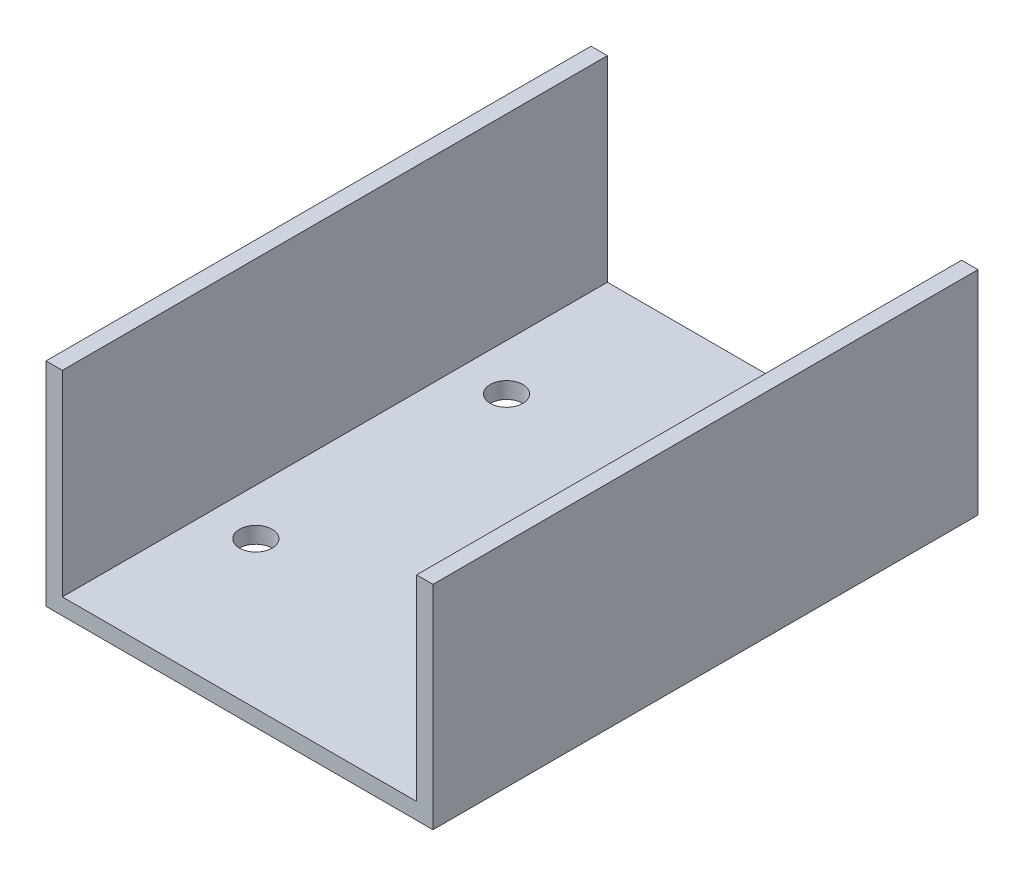
ISO-10303-21;
HEADER;
FILE_DESCRIPTION(('STEP AP214'),'2;1');
FILE_NAME('part.step','',(''),(''),'','','');
FILE_SCHEMA(('AUTOMOTIVE_DESIGN { 1 0 10303 214 1 1 1 1 }'));
ENDSEC;
DATA;
#1=APPLICATION_CONTEXT('core data for automotive mechanical design processes');
#2=APPLICATION_PROTOCOL_DEFINITION('international standard','automotive_design',2000,#1);
#3=PRODUCT_CONTEXT('',#1,'mechanical');
#4=PRODUCT('Part','Part','',(#3));
#5=PRODUCT_RELATED_PRODUCT_CATEGORY('part','',(#4));
#6=PRODUCT_DEFINITION_FORMATION('','',#4);
#7=PRODUCT_DEFINITION_CONTEXT('part definition',#1,'design');
#8=PRODUCT_DEFINITION('design','',#6,#7);
#9=PRODUCT_DEFINITION_SHAPE('','',#8);
#10=(LENGTH_UNIT() NAMED_UNIT(*) SI_UNIT(.MILLI.,.METRE.));
#11=(NAMED_UNIT(*) PLANE_ANGLE_UNIT() SI_UNIT($,.RADIAN.));
#12=(NAMED_UNIT(*) SI_UNIT($,.STERADIAN.) SOLID_ANGLE_UNIT());
#13=UNCERTAINTY_MEASURE_WITH_UNIT(LENGTH_MEASURE(1.E-05),#10,'distance_accuracy_value','');
#14=(GEOMETRIC_REPRESENTATION_CONTEXT(3) GLOBAL_UNCERTAINTY_ASSIGNED_CONTEXT((#13)) GLOBAL_UNIT_ASSIGNED_CONTEXT((#10,
#11,#12)) REPRESENTATION_CONTEXT('',''));
#15=CARTESIAN_POINT('',(0.,0.,0.));
#16=DIRECTION('',(0.,0.,1.));
#17=DIRECTION('',(1.,0.,0.));
#18=AXIS2_PLACEMENT_3D('',#15,#16,#17);
#19=CARTESIAN_POINT('',(17.75,0.,25.));
#20=DIRECTION('',(-1.,0.,0.));
#21=DIRECTION('',(0.,0.,1.));
#22=AXIS2_PLACEMENT_3D('',#19,#20,#21);
#23=PLANE('',#22);
#24=DIRECTION('',(0.,1.,0.));
#25=VECTOR('',#24,1.);
#26=CARTESIAN_POINT('',(17.75,0.,-25.));
#27=LINE('',#26,#25);
#28=CARTESIAN_POINT('',(17.75,0.,-25.));
#29=VERTEX_POINT('',#28);
#30=CARTESIAN_POINT('',(17.75,19.5,-25.));
#31=VERTEX_POINT('',#30);
#32=EDGE_CURVE('E130',#29,#31,#27,.T.);
#33=ORIENTED_EDGE('',*,*,#32,.T.);
#34=DIRECTION('',(0.,0.,-1.));
#35=VECTOR('',#34,1.);
#36=CARTESIAN_POINT('',(17.75,19.5,25.));
#37=LINE('',#36,#35);
#38=CARTESIAN_POINT('',(17.75,19.5,25.));
#39=VERTEX_POINT('',#38);
#40=EDGE_CURVE('E11',#39,#31,#37,.T.);
#41=ORIENTED_EDGE('',*,*,#40,.F.);
#42=DIRECTION('',(0.,1.,0.));
#43=VECTOR('',#42,1.);
#44=CARTESIAN_POINT('',(17.75,0.,25.));
#45=LINE('',#44,#43);
#46=CARTESIAN_POINT('',(17.75,0.,25.));
#47=VERTEX_POINT('',#46);
#48=EDGE_CURVE('E88',#47,#39,#45,.T.);
#49=ORIENTED_EDGE('',*,*,#48,.F.);
#50=DIRECTION('',(0.,0.,-1.));
#51=VECTOR('',#50,1.);
#52=CARTESIAN_POINT('',(17.75,0.,25.));
#53=LINE('',#52,#51);
#54=EDGE_CURVE('E129',#47,#29,#53,.T.);
#55=ORIENTED_EDGE('',*,*,#54,.T.);
#56=EDGE_LOOP('',(#33,#41,#49,#55));
#57=FACE_BOUND('',#56,.T.);
#58=ADVANCED_FACE('F33',(#57),#23,.F.);
#59=CARTESIAN_POINT('',(16.25,19.5,25.));
#60=DIRECTION('',(0.,1.,0.));
#61=DIRECTION('',(0.,0.,1.));
#62=AXIS2_PLACEMENT_3D('',#59,#60,#61);
#63=PLANE('',#62);
#64=DIRECTION('',(1.,0.,0.));
#65=VECTOR('',#64,1.);
#66=CARTESIAN_POINT('',(16.25,19.5,-25.));
#67=LINE('',#66,#65);
#68=CARTESIAN_POINT('',(16.25,19.5,-25.));
#69=VERTEX_POINT('',#68);
#70=EDGE_CURVE('E133',#69,#31,#67,.T.);
#71=ORIENTED_EDGE('',*,*,#70,.F.);
#72=DIRECTION('',(0.,0.,-1.));
#73=VECTOR('',#72,1.);
#74=CARTESIAN_POINT('',(16.25,19.5,25.));
#75=LINE('',#74,#73);
#76=CARTESIAN_POINT('',(16.25,19.5,25.));
#77=VERTEX_POINT('',#76);
#78=EDGE_CURVE('E41',#77,#69,#75,.T.);
#79=ORIENTED_EDGE('',*,*,#78,.F.);
#80=DIRECTION('',(1.,0.,0.));
#81=VECTOR('',#80,1.);
#82=CARTESIAN_POINT('',(16.25,19.5,25.));
#83=LINE('',#82,#81);
#84=EDGE_CURVE('E173',#77,#39,#83,.T.);
#85=ORIENTED_EDGE('',*,*,#84,.T.);
#86=ORIENTED_EDGE('',*,*,#40,.T.);
#87=EDGE_LOOP('',(#71,#79,#85,#86));
#88=FACE_BOUND('',#87,.T.);
#89=ADVANCED_FACE('F164',(#88),#63,.T.);
#90=CARTESIAN_POINT('',(16.25,0.,25.));
#91=DIRECTION('',(-1.,0.,0.));
#92=DIRECTION('',(0.,0.,1.));
#93=AXIS2_PLACEMENT_3D('',#90,#91,#92);
#94=PLANE('',#93);
#95=DIRECTION('',(0.,1.,0.));
#96=VECTOR('',#95,1.);
#97=CARTESIAN_POINT('',(16.25,0.,-25.));
#98=LINE('',#97,#96);
#99=CARTESIAN_POINT('',(16.25,1.5,-25.));
#100=VERTEX_POINT('',#99);
#101=EDGE_CURVE('E137',#100,#69,#98,.T.);
#102=ORIENTED_EDGE('',*,*,#101,.F.);
#103=DIRECTION('',(0.,0.,-1.));
#104=VECTOR('',#103,1.);
#105=CARTESIAN_POINT('',(16.25,1.5,25.));
#106=LINE('',#105,#104);
#107=CARTESIAN_POINT('',(16.25,1.5,25.));
#108=VERTEX_POINT('',#107);
#109=EDGE_CURVE('E154',#108,#100,#106,.T.);
#110=ORIENTED_EDGE('',*,*,#109,.F.);
#111=DIRECTION('',(0.,1.,0.));
#112=VECTOR('',#111,1.);
#113=CARTESIAN_POINT('',(16.25,0.,25.));
#114=LINE('',#113,#112);
#115=EDGE_CURVE('E161',#108,#77,#114,.T.);
#116=ORIENTED_EDGE('',*,*,#115,.T.);
#117=ORIENTED_EDGE('',*,*,#78,.T.);
#118=EDGE_LOOP('',(#102,#110,#116,#117));
#119=FACE_BOUND('',#118,.T.);
#120=ADVANCED_FACE('F159',(#119),#94,.T.);
#121=CARTESIAN_POINT('',(-17.75,1.5,25.));
#122=DIRECTION('',(0.,1.,0.));
#123=DIRECTION('',(0.,0.,1.));
#124=AXIS2_PLACEMENT_3D('',#121,#122,#123);
#125=PLANE('',#124);
#126=CARTESIAN_POINT('',(12.,1.5,11.5));
#127=DIRECTION('',(0.,1.,0.));
#128=DIRECTION('',(0.,0.,1.));
#129=AXIS2_PLACEMENT_3D('',#126,#127,#128);
#130=CIRCLE('',#129,1.5);
#131=CARTESIAN_POINT('',(12.,1.5,13.));
#132=VERTEX_POINT('',#131);
#133=EDGE_CURVE('E134',#132,#132,#130,.T.);
#134=ORIENTED_EDGE('',*,*,#133,.F.);
#135=EDGE_LOOP('',(#134));
#136=FACE_BOUND('',#135,.T.);
#137=CARTESIAN_POINT('',(-12.,1.5,-11.5));
#138=DIRECTION('',(0.,1.,0.));
#139=DIRECTION('',(0.,0.,1.));
#140=AXIS2_PLACEMENT_3D('',#137,#138,#139);
#141=CIRCLE('',#140,1.5);
#142=CARTESIAN_POINT('',(-12.,1.5,-10.));
#143=VERTEX_POINT('',#142);
#144=EDGE_CURVE('E180',#143,#143,#141,.T.);
#145=ORIENTED_EDGE('',*,*,#144,.F.);
#146=EDGE_LOOP('',(#145));
#147=FACE_BOUND('',#146,.T.);
#148=CARTESIAN_POINT('',(-12.,1.5,11.5));
#149=DIRECTION('',(0.,1.,0.));
#150=DIRECTION('',(0.,0.,1.));
#151=AXIS2_PLACEMENT_3D('',#148,#149,#150);
#152=CIRCLE('',#151,1.5);
#153=CARTESIAN_POINT('',(-12.,1.5,13.));
#154=VERTEX_POINT('',#153);
#155=EDGE_CURVE('E183',#154,#154,#152,.T.);
#156=ORIENTED_EDGE('',*,*,#155,.F.);
#157=EDGE_LOOP('',(#156));
#158=FACE_BOUND('',#157,.T.);
#159=CARTESIAN_POINT('',(12.,1.5,-11.5));
#160=DIRECTION('',(0.,1.,0.));
#161=DIRECTION('',(0.,0.,1.));
#162=AXIS2_PLACEMENT_3D('',#159,#160,#161);
#163=CIRCLE('',#162,1.5);
#164=CARTESIAN_POINT('',(12.,1.5,-10.));
#165=VERTEX_POINT('',#164);
#166=EDGE_CURVE('E186',#165,#165,#163,.T.);
#167=ORIENTED_EDGE('',*,*,#166,.F.);
#168=EDGE_LOOP('',(#167));
#169=FACE_BOUND('',#168,.T.);
#170=DIRECTION('',(1.,0.,0.));
#171=VECTOR('',#170,1.);
#172=CARTESIAN_POINT('',(-17.75,1.5,-25.));
#173=LINE('',#172,#171);
#174=CARTESIAN_POINT('',(-16.25,1.5,-25.));
#175=VERTEX_POINT('',#174);
#176=EDGE_CURVE('E140',#175,#100,#173,.T.);
#177=ORIENTED_EDGE('',*,*,#176,.F.);
#178=DIRECTION('',(0.,0.,-1.));
#179=VECTOR('',#178,1.);
#180=CARTESIAN_POINT('',(-16.25,1.5,25.));
#181=LINE('',#180,#179);
#182=CARTESIAN_POINT('',(-16.25,1.5,25.));
#183=VERTEX_POINT('',#182);
#184=EDGE_CURVE('E152',#183,#175,#181,.T.);
#185=ORIENTED_EDGE('',*,*,#184,.F.);
#186=DIRECTION('',(1.,0.,0.));
#187=VECTOR('',#186,1.);
#188=CARTESIAN_POINT('',(-17.75,1.5,25.));
#189=LINE('',#188,#187);
#190=EDGE_CURVE('E124',#183,#108,#189,.T.);
#191=ORIENTED_EDGE('',*,*,#190,.T.);
#192=ORIENTED_EDGE('',*,*,#109,.T.);
#193=EDGE_LOOP('',(#177,#185,#191,#192));
#194=FACE_BOUND('',#193,.T.);
#195=ADVANCED_FACE('F171',(#136,#147,#158,#169,#194),#125,.T.);
#196=CARTESIAN_POINT('',(-16.25,19.5,25.));
#197=DIRECTION('',(1.,0.,0.));
#198=DIRECTION('',(0.,0.,-1.));
#199=AXIS2_PLACEMENT_3D('',#196,#197,#198);
#200=PLANE('',#199);
#201=DIRECTION('',(0.,1.,0.));
#202=VECTOR('',#201,1.);
#203=CARTESIAN_POINT('',(-16.25,19.5,-25.));
#204=LINE('',#203,#202);
#205=CARTESIAN_POINT('',(-16.25,19.5,-25.));
#206=VERTEX_POINT('',#205);
#207=EDGE_CURVE('E143',#206,#175,#204,.F.);
#208=ORIENTED_EDGE('',*,*,#207,.F.);
#209=DIRECTION('',(0.,0.,-1.));
#210=VECTOR('',#209,1.);
#211=CARTESIAN_POINT('',(-16.25,19.5,25.));
#212=LINE('',#211,#210);
#213=CARTESIAN_POINT('',(-16.25,19.5,25.));
#214=VERTEX_POINT('',#213);
#215=EDGE_CURVE('E112',#214,#206,#212,.T.);
#216=ORIENTED_EDGE('',*,*,#215,.F.);
#217=DIRECTION('',(0.,1.,0.));
#218=VECTOR('',#217,1.);
#219=CARTESIAN_POINT('',(-16.25,19.5,25.));
#220=LINE('',#219,#218);
#221=EDGE_CURVE('E122',#214,#183,#220,.F.);
#222=ORIENTED_EDGE('',*,*,#221,.T.);
#223=ORIENTED_EDGE('',*,*,#184,.T.);
#224=EDGE_LOOP('',(#208,#216,#222,#223));
#225=FACE_BOUND('',#224,.T.);
#226=ADVANCED_FACE('F237',(#225),#200,.T.);
#227=CARTESIAN_POINT('',(-17.75,19.5,25.));
#228=DIRECTION('',(0.,1.,0.));
#229=DIRECTION('',(0.,0.,1.));
#230=AXIS2_PLACEMENT_3D('',#227,#228,#229);
#231=PLANE('',#230);
#232=DIRECTION('',(1.,0.,0.));
#233=VECTOR('',#232,1.);
#234=CARTESIAN_POINT('',(-17.75,19.5,-25.));
#235=LINE('',#234,#233);
#236=CARTESIAN_POINT('',(-17.75,19.5,-25.));
#237=VERTEX_POINT('',#236);
#238=EDGE_CURVE('E111',#237,#206,#235,.T.);
#239=ORIENTED_EDGE('',*,*,#238,.F.);
#240=DIRECTION('',(0.,0.,-1.));
#241=VECTOR('',#240,1.);
#242=CARTESIAN_POINT('',(-17.75,19.5,25.));
#243=LINE('',#242,#241);
#244=CARTESIAN_POINT('',(-17.75,19.5,25.));
#245=VERTEX_POINT('',#244);
#246=EDGE_CURVE('E105',#245,#237,#243,.T.);
#247=ORIENTED_EDGE('',*,*,#246,.F.);
#248=DIRECTION('',(1.,0.,0.));
#249=VECTOR('',#248,1.);
#250=CARTESIAN_POINT('',(-17.75,19.5,25.));
#251=LINE('',#250,#249);
#252=EDGE_CURVE('E109',#245,#214,#251,.T.);
#253=ORIENTED_EDGE('',*,*,#252,.T.);
#254=ORIENTED_EDGE('',*,*,#215,.T.);
#255=EDGE_LOOP('',(#239,#247,#253,#254));
#256=FACE_BOUND('',#255,.T.);
#257=ADVANCED_FACE('F107',(#256),#231,.T.);
#258=CARTESIAN_POINT('',(-17.75,19.5,25.));
#259=DIRECTION('',(1.,0.,0.));
#260=DIRECTION('',(0.,0.,-1.));
#261=AXIS2_PLACEMENT_3D('',#258,#259,#260);
#262=PLANE('',#261);
#263=DIRECTION('',(0.,-1.,0.));
#264=VECTOR('',#263,1.);
#265=CARTESIAN_POINT('',(-17.75,19.5,-25.));
#266=LINE('',#265,#264);
#267=CARTESIAN_POINT('',(-17.75,0.,-25.));
#268=VERTEX_POINT('',#267);
#269=EDGE_CURVE('E76',#237,#268,#266,.T.);
#270=ORIENTED_EDGE('',*,*,#269,.T.);
#271=DIRECTION('',(0.,0.,-1.));
#272=VECTOR('',#271,1.);
#273=CARTESIAN_POINT('',(-17.75,0.,25.));
#274=LINE('',#273,#272);
#275=CARTESIAN_POINT('',(-17.75,0.,25.));
#276=VERTEX_POINT('',#275);
#277=EDGE_CURVE('E113',#276,#268,#274,.T.);
#278=ORIENTED_EDGE('',*,*,#277,.F.);
#279=DIRECTION('',(0.,-1.,0.));
#280=VECTOR('',#279,1.);
#281=CARTESIAN_POINT('',(-17.75,19.5,25.));
#282=LINE('',#281,#280);
#283=EDGE_CURVE('E115',#245,#276,#282,.T.);
#284=ORIENTED_EDGE('',*,*,#283,.F.);
#285=ORIENTED_EDGE('',*,*,#246,.T.);
#286=EDGE_LOOP('',(#270,#278,#284,#285));
#287=FACE_BOUND('',#286,.T.);
#288=ADVANCED_FACE('F116',(#287),#262,.F.);
#289=CARTESIAN_POINT('',(-17.75,0.,25.));
#290=DIRECTION('',(0.,1.,0.));
#291=DIRECTION('',(0.,0.,1.));
#292=AXIS2_PLACEMENT_3D('',#289,#290,#291);
#293=PLANE('',#292);
#294=CARTESIAN_POINT('',(12.,0.,11.5));
#295=DIRECTION('',(0.,-1.,0.));
#296=DIRECTION('',(0.,0.,1.));
#297=AXIS2_PLACEMENT_3D('',#294,#295,#296);
#298=CIRCLE('',#297,1.5);
#299=CARTESIAN_POINT('',(12.,0.,13.));
#300=VERTEX_POINT('',#299);
#301=EDGE_CURVE('E192',#300,#300,#298,.T.);
#302=ORIENTED_EDGE('',*,*,#301,.F.);
#303=EDGE_LOOP('',(#302));
#304=FACE_BOUND('',#303,.T.);
#305=CARTESIAN_POINT('',(-12.,0.,-11.5));
#306=DIRECTION('',(0.,-1.,0.));
#307=DIRECTION('',(0.,0.,1.));
#308=AXIS2_PLACEMENT_3D('',#305,#306,#307);
#309=CIRCLE('',#308,1.5);
#310=CARTESIAN_POINT('',(-12.,0.,-10.));
#311=VERTEX_POINT('',#310);
#312=EDGE_CURVE('E193',#311,#311,#309,.T.);
#313=ORIENTED_EDGE('',*,*,#312,.F.);
#314=EDGE_LOOP('',(#313));
#315=FACE_BOUND('',#314,.T.);
#316=CARTESIAN_POINT('',(-12.,0.,11.5));
#317=DIRECTION('',(0.,-1.,0.));
#318=DIRECTION('',(0.,0.,-1.));
#319=AXIS2_PLACEMENT_3D('',#316,#317,#318);
#320=CIRCLE('',#319,1.5);
#321=CARTESIAN_POINT('',(-12.,0.,10.));
#322=VERTEX_POINT('',#321);
#323=EDGE_CURVE('E196',#322,#322,#320,.T.);
#324=ORIENTED_EDGE('',*,*,#323,.F.);
#325=EDGE_LOOP('',(#324));
#326=FACE_BOUND('',#325,.T.);
#327=CARTESIAN_POINT('',(12.,0.,-11.5));
#328=DIRECTION('',(0.,-1.,0.));
#329=DIRECTION('',(0.,0.,-1.));
#330=AXIS2_PLACEMENT_3D('',#327,#328,#329);
#331=CIRCLE('',#330,1.5);
#332=CARTESIAN_POINT('',(12.,0.,-13.));
#333=VERTEX_POINT('',#332);
#334=EDGE_CURVE('E189',#333,#333,#331,.T.);
#335=ORIENTED_EDGE('',*,*,#334,.F.);
#336=EDGE_LOOP('',(#335));
#337=FACE_BOUND('',#336,.T.);
#338=DIRECTION('',(1.,0.,0.));
#339=VECTOR('',#338,1.);
#340=CARTESIAN_POINT('',(-17.75,0.,-25.));
#341=LINE('',#340,#339);
#342=EDGE_CURVE('E82',#268,#29,#341,.T.);
#343=ORIENTED_EDGE('',*,*,#342,.T.);
#344=ORIENTED_EDGE('',*,*,#54,.F.);
#345=DIRECTION('',(1.,0.,0.));
#346=VECTOR('',#345,1.);
#347=CARTESIAN_POINT('',(-17.75,0.,25.));
#348=LINE('',#347,#346);
#349=EDGE_CURVE('E49',#276,#47,#348,.T.);
#350=ORIENTED_EDGE('',*,*,#349,.F.);
#351=ORIENTED_EDGE('',*,*,#277,.T.);
#352=EDGE_LOOP('',(#343,#344,#350,#351));
#353=FACE_BOUND('',#352,.T.);
#354=ADVANCED_FACE('F204',(#304,#315,#326,#337,#353),#293,.F.);
#355=CARTESIAN_POINT('',(0.,0.,25.));
#356=DIRECTION('',(0.,0.,-1.));
#357=DIRECTION('',(-1.,0.,0.));
#358=AXIS2_PLACEMENT_3D('',#355,#356,#357);
#359=PLANE('',#358);
#360=ORIENTED_EDGE('',*,*,#48,.T.);
#361=ORIENTED_EDGE('',*,*,#84,.F.);
#362=ORIENTED_EDGE('',*,*,#115,.F.);
#363=ORIENTED_EDGE('',*,*,#190,.F.);
#364=ORIENTED_EDGE('',*,*,#221,.F.);
#365=ORIENTED_EDGE('',*,*,#252,.F.);
#366=ORIENTED_EDGE('',*,*,#283,.T.);
#367=ORIENTED_EDGE('',*,*,#349,.T.);
#368=EDGE_LOOP('',(#360,#361,#362,#363,#364,#365,#366,#367));
#369=FACE_BOUND('',#368,.T.);
#370=ADVANCED_FACE('F119',(#369),#359,.F.);
#371=CARTESIAN_POINT('',(0.,0.,-25.));
#372=DIRECTION('',(0.,0.,-1.));
#373=DIRECTION('',(-1.,0.,0.));
#374=AXIS2_PLACEMENT_3D('',#371,#372,#373);
#375=PLANE('',#374);
#376=ORIENTED_EDGE('',*,*,#32,.F.);
#377=ORIENTED_EDGE('',*,*,#342,.F.);
#378=ORIENTED_EDGE('',*,*,#269,.F.);
#379=ORIENTED_EDGE('',*,*,#238,.T.);
#380=ORIENTED_EDGE('',*,*,#207,.T.);
#381=ORIENTED_EDGE('',*,*,#176,.T.);
#382=ORIENTED_EDGE('',*,*,#101,.T.);
#383=ORIENTED_EDGE('',*,*,#70,.T.);
#384=EDGE_LOOP('',(#376,#377,#378,#379,#380,#381,#382,#383));
#385=FACE_BOUND('',#384,.T.);
#386=ADVANCED_FACE('F167',(#385),#375,.T.);
#387=CARTESIAN_POINT('',(12.,3.,-11.5));
#388=DIRECTION('',(0.,-1.,0.));
#389=DIRECTION('',(0.,0.,-1.));
#390=AXIS2_PLACEMENT_3D('',#387,#388,#389);
#391=CYLINDRICAL_SURFACE('',#390,1.5);
#392=ORIENTED_EDGE('',*,*,#166,.T.);
#393=EDGE_LOOP('',(#392));
#394=FACE_BOUND('',#393,.T.);
#395=ORIENTED_EDGE('',*,*,#334,.T.);
#396=EDGE_LOOP('',(#395));
#397=FACE_BOUND('',#396,.T.);
#398=ADVANCED_FACE('F211',(#394,#397),#391,.F.);
#399=CARTESIAN_POINT('',(-12.,3.,11.5));
#400=DIRECTION('',(0.,-1.,0.));
#401=DIRECTION('',(0.,0.,-1.));
#402=AXIS2_PLACEMENT_3D('',#399,#400,#401);
#403=CYLINDRICAL_SURFACE('',#402,1.5);
#404=ORIENTED_EDGE('',*,*,#155,.T.);
#405=EDGE_LOOP('',(#404));
#406=FACE_BOUND('',#405,.T.);
#407=ORIENTED_EDGE('',*,*,#323,.T.);
#408=EDGE_LOOP('',(#407));
#409=FACE_BOUND('',#408,.T.);
#410=ADVANCED_FACE('F202',(#406,#409),#403,.F.);
#411=CARTESIAN_POINT('',(-12.,3.,-11.5));
#412=DIRECTION('',(0.,-1.,0.));
#413=DIRECTION('',(0.,0.,-1.));
#414=AXIS2_PLACEMENT_3D('',#411,#412,#413);
#415=CYLINDRICAL_SURFACE('',#414,1.5);
#416=ORIENTED_EDGE('',*,*,#144,.T.);
#417=EDGE_LOOP('',(#416));
#418=FACE_BOUND('',#417,.T.);
#419=ORIENTED_EDGE('',*,*,#312,.T.);
#420=EDGE_LOOP('',(#419));
#421=FACE_BOUND('',#420,.T.);
#422=ADVANCED_FACE('F219',(#418,#421),#415,.F.);
#423=CARTESIAN_POINT('',(12.,3.,11.5));
#424=DIRECTION('',(0.,-1.,0.));
#425=DIRECTION('',(0.,0.,-1.));
#426=AXIS2_PLACEMENT_3D('',#423,#424,#425);
#427=CYLINDRICAL_SURFACE('',#426,1.5);
#428=ORIENTED_EDGE('',*,*,#133,.T.);
#429=EDGE_LOOP('',(#428));
#430=FACE_BOUND('',#429,.T.);
#431=ORIENTED_EDGE('',*,*,#301,.T.);
#432=EDGE_LOOP('',(#431));
#433=FACE_BOUND('',#432,.T.);
#434=ADVANCED_FACE('F287',(#430,#433),#427,.F.);
#435=CLOSED_SHELL('',(#58,#89,#120,#195,#226,#257,#288,#354,#370,#386,#398,#410,#422,#434));
#436=MANIFOLD_SOLID_BREP('B2',#435);
#437=ADVANCED_BREP_SHAPE_REPRESENTATION('',(#18,#436),#14);
#438=SHAPE_DEFINITION_REPRESENTATION(#9,#437);
ENDSEC;
END-ISO-10303-21;
